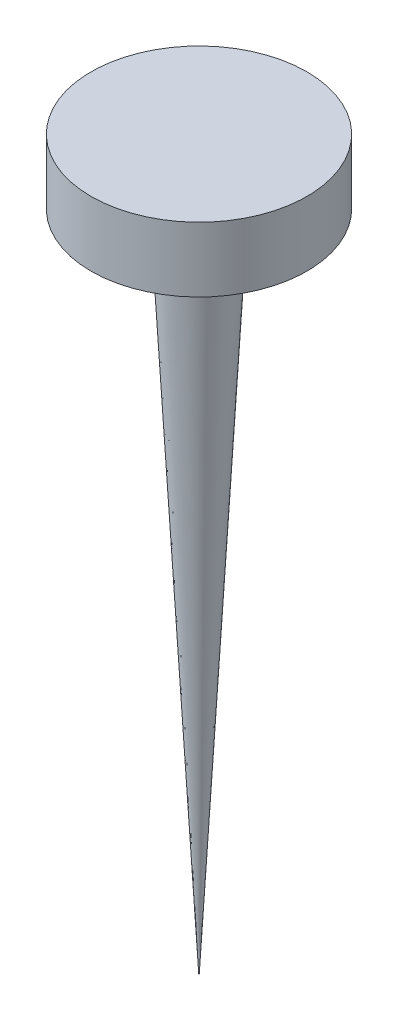
ISO-10303-21;
HEADER;
FILE_DESCRIPTION(('STEP AP214'),'2;1');
FILE_NAME('part.step','',(''),(''),'','','');
FILE_SCHEMA(('AUTOMOTIVE_DESIGN { 1 0 10303 214 1 1 1 1 }'));
ENDSEC;
DATA;
#1=APPLICATION_CONTEXT('core data for automotive mechanical design processes');
#2=APPLICATION_PROTOCOL_DEFINITION('international standard','automotive_design',2000,#1);
#3=PRODUCT_CONTEXT('',#1,'mechanical');
#4=PRODUCT('Part','Part','',(#3));
#5=PRODUCT_RELATED_PRODUCT_CATEGORY('part','',(#4));
#6=PRODUCT_DEFINITION_FORMATION('','',#4);
#7=PRODUCT_DEFINITION_CONTEXT('part definition',#1,'design');
#8=PRODUCT_DEFINITION('design','',#6,#7);
#9=PRODUCT_DEFINITION_SHAPE('','',#8);
#10=(LENGTH_UNIT() NAMED_UNIT(*) SI_UNIT(.MILLI.,.METRE.));
#11=(NAMED_UNIT(*) PLANE_ANGLE_UNIT() SI_UNIT($,.RADIAN.));
#12=(NAMED_UNIT(*) SI_UNIT($,.STERADIAN.) SOLID_ANGLE_UNIT());
#13=UNCERTAINTY_MEASURE_WITH_UNIT(LENGTH_MEASURE(1.E-05),#10,'distance_accuracy_value','');
#14=(GEOMETRIC_REPRESENTATION_CONTEXT(3) GLOBAL_UNCERTAINTY_ASSIGNED_CONTEXT((#13)) GLOBAL_UNIT_ASSIGNED_CONTEXT((#10,
#11,#12)) REPRESENTATION_CONTEXT('',''));
#15=CARTESIAN_POINT('',(0.,0.,0.));
#16=DIRECTION('',(0.,0.,1.));
#17=DIRECTION('',(1.,0.,0.));
#18=AXIS2_PLACEMENT_3D('',#15,#16,#17);
#19=CARTESIAN_POINT('',(0.,-0.3,0.));
#20=DIRECTION('',(0.,1.,0.));
#21=DIRECTION('',(0.,0.,1.));
#22=AXIS2_PLACEMENT_3D('',#19,#20,#21);
#23=CONICAL_SURFACE('',#22,0.161677999088173,0.052359877559827);
#24=CARTESIAN_POINT('',(0.,-3.385,0.));
#25=VERTEX_POINT('',#24);
#26=VERTEX_LOOP('',#25);
#27=FACE_BOUND('',#26,.T.);
#28=CARTESIAN_POINT('',(0.,-0.3,0.));
#29=DIRECTION('',(0.,1.,0.));
#30=DIRECTION('',(0.,0.,1.));
#31=AXIS2_PLACEMENT_3D('',#28,#29,#30);
#32=CIRCLE('',#31,0.161677999088173);
#33=CARTESIAN_POINT('',(0.,-0.3,0.161677999088173));
#34=VERTEX_POINT('',#33);
#35=EDGE_CURVE('E59',#34,#34,#32,.T.);
#36=ORIENTED_EDGE('',*,*,#35,.F.);
#37=EDGE_LOOP('',(#36));
#38=FACE_BOUND('',#37,.T.);
#39=ADVANCED_FACE('F45',(#27,#38),#23,.T.);
#40=CARTESIAN_POINT('',(-0.5,0.,0.));
#41=DIRECTION('',(0.,1.,0.));
#42=DIRECTION('',(0.,0.,1.));
#43=AXIS2_PLACEMENT_3D('',#40,#41,#42);
#44=PLANE('',#43);
#45=CARTESIAN_POINT('',(0.,0.,0.));
#46=DIRECTION('',(0.,1.,0.));
#47=DIRECTION('',(0.,0.,1.));
#48=AXIS2_PLACEMENT_3D('',#45,#46,#47);
#49=CIRCLE('',#48,0.5);
#50=CARTESIAN_POINT('',(0.,0.,0.5));
#51=VERTEX_POINT('',#50);
#52=EDGE_CURVE('E11',#51,#51,#49,.T.);
#53=ORIENTED_EDGE('',*,*,#52,.T.);
#54=EDGE_LOOP('',(#53));
#55=FACE_BOUND('',#54,.T.);
#56=ADVANCED_FACE('F56',(#55),#44,.T.);
#57=CARTESIAN_POINT('',(0.,0.,0.));
#58=DIRECTION('',(0.,1.,0.));
#59=DIRECTION('',(0.,0.,1.));
#60=AXIS2_PLACEMENT_3D('',#57,#58,#59);
#61=CYLINDRICAL_SURFACE('',#60,0.5);
#62=CARTESIAN_POINT('',(0.,-0.3,0.));
#63=DIRECTION('',(0.,1.,0.));
#64=DIRECTION('',(0.,0.,1.));
#65=AXIS2_PLACEMENT_3D('',#62,#63,#64);
#66=CIRCLE('',#65,0.5);
#67=CARTESIAN_POINT('',(0.,-0.3,0.5));
#68=VERTEX_POINT('',#67);
#69=EDGE_CURVE('E51',#68,#68,#66,.T.);
#70=ORIENTED_EDGE('',*,*,#69,.T.);
#71=EDGE_LOOP('',(#70));
#72=FACE_BOUND('',#71,.T.);
#73=ORIENTED_EDGE('',*,*,#52,.F.);
#74=EDGE_LOOP('',(#73));
#75=FACE_BOUND('',#74,.T.);
#76=ADVANCED_FACE('F65',(#72,#75),#61,.T.);
#77=CARTESIAN_POINT('',(-0.5,-0.3,0.));
#78=DIRECTION('',(0.,-1.,0.));
#79=DIRECTION('',(0.,0.,-1.));
#80=AXIS2_PLACEMENT_3D('',#77,#78,#79);
#81=PLANE('',#80);
#82=ORIENTED_EDGE('',*,*,#35,.T.);
#83=EDGE_LOOP('',(#82));
#84=FACE_BOUND('',#83,.T.);
#85=ORIENTED_EDGE('',*,*,#69,.F.);
#86=EDGE_LOOP('',(#85));
#87=FACE_BOUND('',#86,.T.);
#88=ADVANCED_FACE('F68',(#84,#87),#81,.T.);
#89=CLOSED_SHELL('',(#39,#56,#76,#88));
#90=MANIFOLD_SOLID_BREP('B2',#89);
#91=ADVANCED_BREP_SHAPE_REPRESENTATION('',(#18,#90),#14);
#92=SHAPE_DEFINITION_REPRESENTATION(#9,#91);
ENDSEC;
END-ISO-10303-21;
